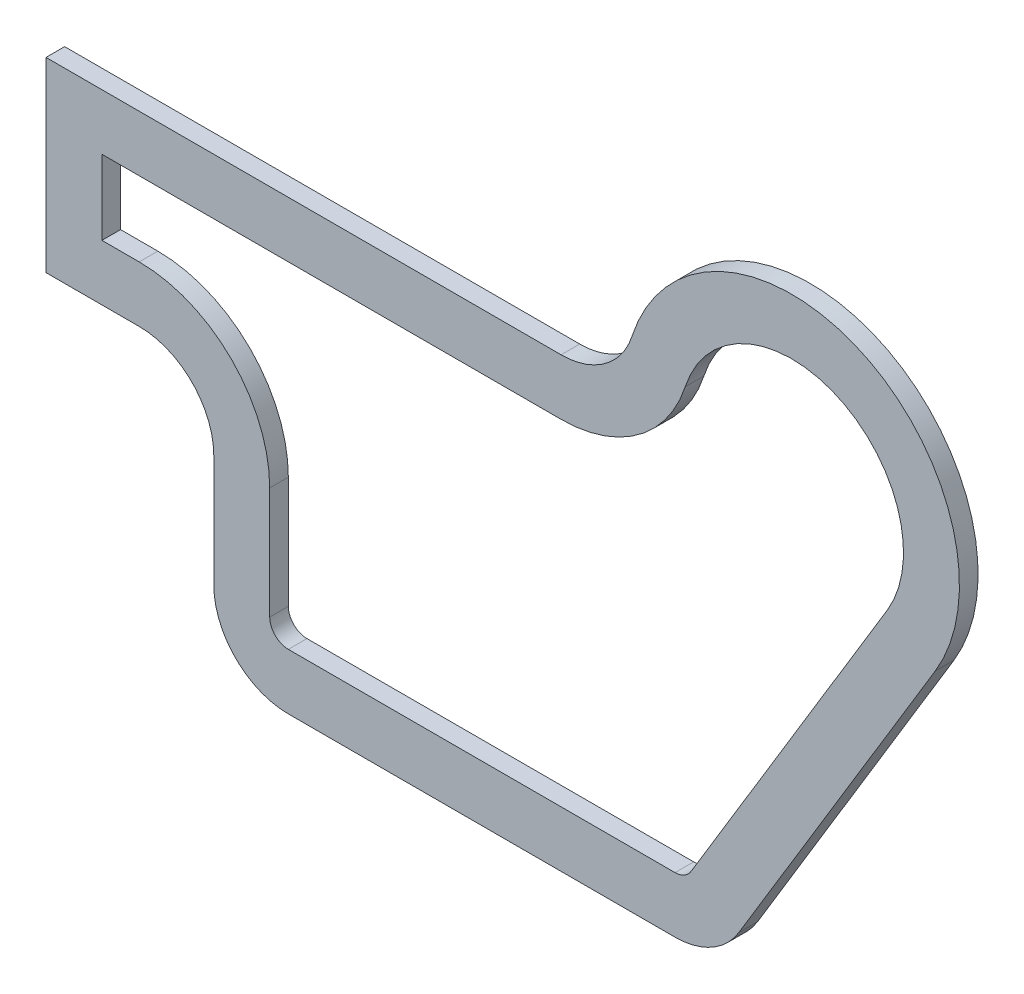
ISO-10303-21;
HEADER;
FILE_DESCRIPTION(('STEP AP214'),'2;1');
FILE_NAME('part.step','',(''),(''),'','','');
FILE_SCHEMA(('AUTOMOTIVE_DESIGN { 1 0 10303 214 1 1 1 1 }'));
ENDSEC;
DATA;
#1=APPLICATION_CONTEXT('core data for automotive mechanical design processes');
#2=APPLICATION_PROTOCOL_DEFINITION('international standard','automotive_design',2000,#1);
#3=PRODUCT_CONTEXT('',#1,'mechanical');
#4=PRODUCT('Part','Part','',(#3));
#5=PRODUCT_RELATED_PRODUCT_CATEGORY('part','',(#4));
#6=PRODUCT_DEFINITION_FORMATION('','',#4);
#7=PRODUCT_DEFINITION_CONTEXT('part definition',#1,'design');
#8=PRODUCT_DEFINITION('design','',#6,#7);
#9=PRODUCT_DEFINITION_SHAPE('','',#8);
#10=(LENGTH_UNIT() NAMED_UNIT(*) SI_UNIT(.MILLI.,.METRE.));
#11=(NAMED_UNIT(*) PLANE_ANGLE_UNIT() SI_UNIT($,.RADIAN.));
#12=(NAMED_UNIT(*) SI_UNIT($,.STERADIAN.) SOLID_ANGLE_UNIT());
#13=UNCERTAINTY_MEASURE_WITH_UNIT(LENGTH_MEASURE(1.E-05),#10,'distance_accuracy_value','');
#14=(GEOMETRIC_REPRESENTATION_CONTEXT(3) GLOBAL_UNCERTAINTY_ASSIGNED_CONTEXT((#13)) GLOBAL_UNIT_ASSIGNED_CONTEXT((#10,
#11,#12)) REPRESENTATION_CONTEXT('',''));
#15=CARTESIAN_POINT('',(0.,0.,0.));
#16=DIRECTION('',(0.,0.,1.));
#17=DIRECTION('',(1.,0.,0.));
#18=AXIS2_PLACEMENT_3D('',#15,#16,#17);
#19=CARTESIAN_POINT('',(-45.,120.,5.));
#20=DIRECTION('',(0.,-1.,0.));
#21=DIRECTION('',(0.,0.,-1.));
#22=AXIS2_PLACEMENT_3D('',#19,#20,#21);
#23=PLANE('',#22);
#24=DIRECTION('',(-1.,0.,0.));
#25=VECTOR('',#24,1.);
#26=CARTESIAN_POINT('',(-45.,120.,0.));
#27=LINE('',#26,#25);
#28=CARTESIAN_POINT('',(93.1534156157351,120.,0.));
#29=VERTEX_POINT('',#28);
#30=CARTESIAN_POINT('',(-45.,120.,0.));
#31=VERTEX_POINT('',#30);
#32=EDGE_CURVE('E287',#29,#31,#27,.T.);
#33=ORIENTED_EDGE('',*,*,#32,.T.);
#34=DIRECTION('',(0.,0.,-1.));
#35=VECTOR('',#34,1.);
#36=CARTESIAN_POINT('',(-45.,120.,5.));
#37=LINE('',#36,#35);
#38=CARTESIAN_POINT('',(-45.,120.,5.));
#39=VERTEX_POINT('',#38);
#40=EDGE_CURVE('E11',#39,#31,#37,.T.);
#41=ORIENTED_EDGE('',*,*,#40,.F.);
#42=DIRECTION('',(-1.,0.,0.));
#43=VECTOR('',#42,1.);
#44=CARTESIAN_POINT('',(-45.,120.,5.));
#45=LINE('',#44,#43);
#46=CARTESIAN_POINT('',(93.1534156157351,120.,5.));
#47=VERTEX_POINT('',#46);
#48=EDGE_CURVE('E314',#47,#39,#45,.T.);
#49=ORIENTED_EDGE('',*,*,#48,.F.);
#50=DIRECTION('',(0.,0.,-1.));
#51=VECTOR('',#50,1.);
#52=CARTESIAN_POINT('',(93.1534156157351,120.,5.));
#53=LINE('',#52,#51);
#54=EDGE_CURVE('E349',#47,#29,#53,.T.);
#55=ORIENTED_EDGE('',*,*,#54,.T.);
#56=EDGE_LOOP('',(#33,#41,#49,#55));
#57=FACE_BOUND('',#56,.T.);
#58=ADVANCED_FACE('F39',(#57),#23,.F.);
#59=CARTESIAN_POINT('',(-45.,120.,5.));
#60=DIRECTION('',(1.,0.,0.));
#61=DIRECTION('',(0.,0.,-1.));
#62=AXIS2_PLACEMENT_3D('',#59,#60,#61);
#63=PLANE('',#62);
#64=DIRECTION('',(0.,-1.,0.));
#65=VECTOR('',#64,1.);
#66=CARTESIAN_POINT('',(-45.,120.,0.));
#67=LINE('',#66,#65);
#68=CARTESIAN_POINT('',(-45.,70.,0.));
#69=VERTEX_POINT('',#68);
#70=EDGE_CURVE('E353',#31,#69,#67,.T.);
#71=ORIENTED_EDGE('',*,*,#70,.T.);
#72=DIRECTION('',(0.,0.,-1.));
#73=VECTOR('',#72,1.);
#74=CARTESIAN_POINT('',(-45.,70.,5.));
#75=LINE('',#74,#73);
#76=CARTESIAN_POINT('',(-45.,70.,5.));
#77=VERTEX_POINT('',#76);
#78=EDGE_CURVE('E47',#77,#69,#75,.T.);
#79=ORIENTED_EDGE('',*,*,#78,.F.);
#80=DIRECTION('',(0.,-1.,0.));
#81=VECTOR('',#80,1.);
#82=CARTESIAN_POINT('',(-45.,120.,5.));
#83=LINE('',#82,#81);
#84=EDGE_CURVE('E318',#39,#77,#83,.T.);
#85=ORIENTED_EDGE('',*,*,#84,.F.);
#86=ORIENTED_EDGE('',*,*,#40,.T.);
#87=EDGE_LOOP('',(#71,#79,#85,#86));
#88=FACE_BOUND('',#87,.T.);
#89=ADVANCED_FACE('F443',(#88),#63,.F.);
#90=CARTESIAN_POINT('',(-45.,70.,5.));
#91=DIRECTION('',(0.,1.,0.));
#92=DIRECTION('',(0.,0.,1.));
#93=AXIS2_PLACEMENT_3D('',#90,#91,#92);
#94=PLANE('',#93);
#95=DIRECTION('',(1.,0.,0.));
#96=VECTOR('',#95,1.);
#97=CARTESIAN_POINT('',(-45.,70.,0.));
#98=LINE('',#97,#96);
#99=CARTESIAN_POINT('',(-20.0000000000001,70.,0.));
#100=VERTEX_POINT('',#99);
#101=EDGE_CURVE('E356',#69,#100,#98,.T.);
#102=ORIENTED_EDGE('',*,*,#101,.T.);
#103=DIRECTION('',(0.,0.,-1.));
#104=VECTOR('',#103,1.);
#105=CARTESIAN_POINT('',(-20.0000000000001,70.,5.));
#106=LINE('',#105,#104);
#107=CARTESIAN_POINT('',(-20.0000000000001,70.,5.));
#108=VERTEX_POINT('',#107);
#109=EDGE_CURVE('E413',#108,#100,#106,.T.);
#110=ORIENTED_EDGE('',*,*,#109,.F.);
#111=DIRECTION('',(1.,0.,0.));
#112=VECTOR('',#111,1.);
#113=CARTESIAN_POINT('',(-45.,70.,5.));
#114=LINE('',#113,#112);
#115=EDGE_CURVE('E322',#77,#108,#114,.T.);
#116=ORIENTED_EDGE('',*,*,#115,.F.);
#117=ORIENTED_EDGE('',*,*,#78,.T.);
#118=EDGE_LOOP('',(#102,#110,#116,#117));
#119=FACE_BOUND('',#118,.T.);
#120=ADVANCED_FACE('F422',(#119),#94,.F.);
#121=CARTESIAN_POINT('',(-20.,50.,5.));
#122=DIRECTION('',(0.,0.,-1.));
#123=DIRECTION('',(-1.,0.,0.));
#124=AXIS2_PLACEMENT_3D('',#121,#122,#123);
#125=CYLINDRICAL_SURFACE('',#124,20.);
#126=CARTESIAN_POINT('',(-20.,50.,0.));
#127=DIRECTION('',(0.,0.,-1.));
#128=DIRECTION('',(-1.,0.,0.));
#129=AXIS2_PLACEMENT_3D('',#126,#127,#128);
#130=CIRCLE('',#129,20.);
#131=CARTESIAN_POINT('',(0.,49.9999999999999,0.));
#132=VERTEX_POINT('',#131);
#133=EDGE_CURVE('E359',#100,#132,#130,.T.);
#134=ORIENTED_EDGE('',*,*,#133,.T.);
#135=DIRECTION('',(0.,0.,-1.));
#136=VECTOR('',#135,1.);
#137=CARTESIAN_POINT('',(0.,49.9999999999999,5.));
#138=LINE('',#137,#136);
#139=CARTESIAN_POINT('',(0.,49.9999999999999,5.));
#140=VERTEX_POINT('',#139);
#141=EDGE_CURVE('E409',#140,#132,#138,.T.);
#142=ORIENTED_EDGE('',*,*,#141,.F.);
#143=CARTESIAN_POINT('',(-20.,50.,5.));
#144=DIRECTION('',(0.,0.,-1.));
#145=DIRECTION('',(-1.,0.,0.));
#146=AXIS2_PLACEMENT_3D('',#143,#144,#145);
#147=CIRCLE('',#146,20.);
#148=EDGE_CURVE('E325',#108,#140,#147,.T.);
#149=ORIENTED_EDGE('',*,*,#148,.F.);
#150=ORIENTED_EDGE('',*,*,#109,.T.);
#151=EDGE_LOOP('',(#134,#142,#149,#150));
#152=FACE_BOUND('',#151,.T.);
#153=ADVANCED_FACE('F431',(#152),#125,.F.);
#154=CARTESIAN_POINT('',(0.,49.9999999999999,5.));
#155=DIRECTION('',(1.,0.,0.));
#156=DIRECTION('',(0.,0.,-1.));
#157=AXIS2_PLACEMENT_3D('',#154,#155,#156);
#158=PLANE('',#157);
#159=DIRECTION('',(0.,-1.,0.));
#160=VECTOR('',#159,1.);
#161=CARTESIAN_POINT('',(0.,49.9999999999999,0.));
#162=LINE('',#161,#160);
#163=CARTESIAN_POINT('',(0.,20.0000000000001,0.));
#164=VERTEX_POINT('',#163);
#165=EDGE_CURVE('E362',#132,#164,#162,.T.);
#166=ORIENTED_EDGE('',*,*,#165,.T.);
#167=DIRECTION('',(0.,0.,-1.));
#168=VECTOR('',#167,1.);
#169=CARTESIAN_POINT('',(0.,20.0000000000001,5.));
#170=LINE('',#169,#168);
#171=CARTESIAN_POINT('',(0.,20.0000000000001,5.));
#172=VERTEX_POINT('',#171);
#173=EDGE_CURVE('E405',#172,#164,#170,.T.);
#174=ORIENTED_EDGE('',*,*,#173,.F.);
#175=DIRECTION('',(0.,-1.,0.));
#176=VECTOR('',#175,1.);
#177=CARTESIAN_POINT('',(0.,49.9999999999999,5.));
#178=LINE('',#177,#176);
#179=EDGE_CURVE('E328',#140,#172,#178,.T.);
#180=ORIENTED_EDGE('',*,*,#179,.F.);
#181=ORIENTED_EDGE('',*,*,#141,.T.);
#182=EDGE_LOOP('',(#166,#174,#180,#181));
#183=FACE_BOUND('',#182,.T.);
#184=ADVANCED_FACE('F435',(#183),#158,.F.);
#185=CARTESIAN_POINT('',(20.,20.,5.));
#186=DIRECTION('',(0.,0.,-1.));
#187=DIRECTION('',(-1.,0.,0.));
#188=AXIS2_PLACEMENT_3D('',#185,#186,#187);
#189=CYLINDRICAL_SURFACE('',#188,20.);
#190=CARTESIAN_POINT('',(20.,20.,0.));
#191=DIRECTION('',(0.,0.,1.));
#192=DIRECTION('',(1.,0.,0.));
#193=AXIS2_PLACEMENT_3D('',#190,#191,#192);
#194=CIRCLE('',#193,20.);
#195=CARTESIAN_POINT('',(20.0000000000001,0.,0.));
#196=VERTEX_POINT('',#195);
#197=EDGE_CURVE('E365',#164,#196,#194,.T.);
#198=ORIENTED_EDGE('',*,*,#197,.T.);
#199=DIRECTION('',(0.,0.,-1.));
#200=VECTOR('',#199,1.);
#201=CARTESIAN_POINT('',(20.0000000000001,0.,5.));
#202=LINE('',#201,#200);
#203=CARTESIAN_POINT('',(20.0000000000001,0.,5.));
#204=VERTEX_POINT('',#203);
#205=EDGE_CURVE('E401',#204,#196,#202,.T.);
#206=ORIENTED_EDGE('',*,*,#205,.F.);
#207=CARTESIAN_POINT('',(20.,20.,5.));
#208=DIRECTION('',(0.,0.,1.));
#209=DIRECTION('',(1.,0.,0.));
#210=AXIS2_PLACEMENT_3D('',#207,#208,#209);
#211=CIRCLE('',#210,20.);
#212=EDGE_CURVE('E331',#172,#204,#211,.T.);
#213=ORIENTED_EDGE('',*,*,#212,.F.);
#214=ORIENTED_EDGE('',*,*,#173,.T.);
#215=EDGE_LOOP('',(#198,#206,#213,#214));
#216=FACE_BOUND('',#215,.T.);
#217=ADVANCED_FACE('F471',(#216),#189,.T.);
#218=CARTESIAN_POINT('',(20.0000000000001,0.,5.));
#219=DIRECTION('',(0.,1.,0.));
#220=DIRECTION('',(0.,0.,1.));
#221=AXIS2_PLACEMENT_3D('',#218,#219,#220);
#222=PLANE('',#221);
#223=DIRECTION('',(1.,0.,0.));
#224=VECTOR('',#223,1.);
#225=CARTESIAN_POINT('',(20.0000000000001,0.,0.));
#226=LINE('',#225,#224);
#227=CARTESIAN_POINT('',(123.724055084294,0.,0.));
#228=VERTEX_POINT('',#227);
#229=EDGE_CURVE('E368',#196,#228,#226,.T.);
#230=ORIENTED_EDGE('',*,*,#229,.T.);
#231=DIRECTION('',(0.,0.,-1.));
#232=VECTOR('',#231,1.);
#233=CARTESIAN_POINT('',(123.724055084294,0.,5.));
#234=LINE('',#233,#232);
#235=CARTESIAN_POINT('',(123.724055084294,0.,5.));
#236=VERTEX_POINT('',#235);
#237=EDGE_CURVE('E397',#236,#228,#234,.T.);
#238=ORIENTED_EDGE('',*,*,#237,.F.);
#239=DIRECTION('',(1.,0.,0.));
#240=VECTOR('',#239,1.);
#241=CARTESIAN_POINT('',(20.0000000000001,0.,5.));
#242=LINE('',#241,#240);
#243=EDGE_CURVE('E334',#204,#236,#242,.T.);
#244=ORIENTED_EDGE('',*,*,#243,.F.);
#245=ORIENTED_EDGE('',*,*,#205,.T.);
#246=EDGE_LOOP('',(#230,#238,#244,#245));
#247=FACE_BOUND('',#246,.T.);
#248=ADVANCED_FACE('F469',(#247),#222,.F.);
#249=CARTESIAN_POINT('',(123.724055084294,20.,5.));
#250=DIRECTION('',(0.,0.,-1.));
#251=DIRECTION('',(-1.,0.,0.));
#252=AXIS2_PLACEMENT_3D('',#249,#250,#251);
#253=CYLINDRICAL_SURFACE('',#252,20.);
#254=CARTESIAN_POINT('',(123.724055084294,20.,0.));
#255=DIRECTION('',(0.,0.,1.));
#256=DIRECTION('',(1.,0.,0.));
#257=AXIS2_PLACEMENT_3D('',#254,#255,#256);
#258=CIRCLE('',#257,20.);
#259=CARTESIAN_POINT('',(140.836467876928,9.64793120122782,0.));
#260=VERTEX_POINT('',#259);
#261=EDGE_CURVE('E371',#228,#260,#258,.T.);
#262=ORIENTED_EDGE('',*,*,#261,.T.);
#263=DIRECTION('',(0.,0.,-1.));
#264=VECTOR('',#263,1.);
#265=CARTESIAN_POINT('',(140.836467876928,9.64793120122782,5.));
#266=LINE('',#265,#264);
#267=CARTESIAN_POINT('',(140.836467876928,9.64793120122782,5.));
#268=VERTEX_POINT('',#267);
#269=EDGE_CURVE('E393',#268,#260,#266,.T.);
#270=ORIENTED_EDGE('',*,*,#269,.F.);
#271=CARTESIAN_POINT('',(123.724055084294,20.,5.));
#272=DIRECTION('',(0.,0.,1.));
#273=DIRECTION('',(1.,0.,0.));
#274=AXIS2_PLACEMENT_3D('',#271,#272,#273);
#275=CIRCLE('',#274,20.);
#276=EDGE_CURVE('E337',#236,#268,#275,.T.);
#277=ORIENTED_EDGE('',*,*,#276,.F.);
#278=ORIENTED_EDGE('',*,*,#237,.T.);
#279=EDGE_LOOP('',(#262,#270,#277,#278));
#280=FACE_BOUND('',#279,.T.);
#281=ADVANCED_FACE('F464',(#280),#253,.T.);
#282=CARTESIAN_POINT('',(140.836467876928,9.64793120122783,5.));
#283=DIRECTION('',(-0.855620639631674,0.517603439938613,0.));
#284=DIRECTION('',(-0.517603439938613,-0.855620639631674,0.));
#285=AXIS2_PLACEMENT_3D('',#282,#283,#284);
#286=PLANE('',#285);
#287=DIRECTION('',(0.517603439938613,0.855620639631674,0.));
#288=VECTOR('',#287,1.);
#289=CARTESIAN_POINT('',(140.836467876928,9.64793120122783,0.));
#290=LINE('',#289,#288);
#291=CARTESIAN_POINT('',(193.502928783425,96.7078452027624,0.));
#292=VERTEX_POINT('',#291);
#293=EDGE_CURVE('E374',#260,#292,#290,.T.);
#294=ORIENTED_EDGE('',*,*,#293,.T.);
#295=DIRECTION('',(0.,0.,-1.));
#296=VECTOR('',#295,1.);
#297=CARTESIAN_POINT('',(193.502928783425,96.7078452027624,5.));
#298=LINE('',#297,#296);
#299=CARTESIAN_POINT('',(193.502928783425,96.7078452027624,5.));
#300=VERTEX_POINT('',#299);
#301=EDGE_CURVE('E389',#300,#292,#298,.T.);
#302=ORIENTED_EDGE('',*,*,#301,.F.);
#303=DIRECTION('',(0.517603439938613,0.855620639631674,0.));
#304=VECTOR('',#303,1.);
#305=CARTESIAN_POINT('',(140.836467876928,9.64793120122783,5.));
#306=LINE('',#305,#304);
#307=EDGE_CURVE('E340',#268,#300,#306,.T.);
#308=ORIENTED_EDGE('',*,*,#307,.F.);
#309=ORIENTED_EDGE('',*,*,#269,.T.);
#310=EDGE_LOOP('',(#294,#302,#308,#309));
#311=FACE_BOUND('',#310,.T.);
#312=ADVANCED_FACE('F459',(#311),#286,.F.);
#313=CARTESIAN_POINT('',(155.,120.,5.));
#314=DIRECTION('',(0.,0.,-1.));
#315=DIRECTION('',(-1.,0.,0.));
#316=AXIS2_PLACEMENT_3D('',#313,#314,#315);
#317=CYLINDRICAL_SURFACE('',#316,45.);
#318=CARTESIAN_POINT('',(155.,120.,0.));
#319=DIRECTION('',(0.,0.,1.));
#320=DIRECTION('',(1.,0.,0.));
#321=AXIS2_PLACEMENT_3D('',#318,#319,#320);
#322=CIRCLE('',#321,45.);
#323=CARTESIAN_POINT('',(112.183133887817,133.846153846154,0.));
#324=VERTEX_POINT('',#323);
#325=EDGE_CURVE('E377',#292,#324,#322,.T.);
#326=ORIENTED_EDGE('',*,*,#325,.T.);
#327=DIRECTION('',(0.,0.,-1.));
#328=VECTOR('',#327,1.);
#329=CARTESIAN_POINT('',(112.183133887817,133.846153846154,5.));
#330=LINE('',#329,#328);
#331=CARTESIAN_POINT('',(112.183133887817,133.846153846154,5.));
#332=VERTEX_POINT('',#331);
#333=EDGE_CURVE('E385',#332,#324,#330,.T.);
#334=ORIENTED_EDGE('',*,*,#333,.F.);
#335=CARTESIAN_POINT('',(155.,120.,5.));
#336=DIRECTION('',(0.,0.,1.));
#337=DIRECTION('',(1.,0.,0.));
#338=AXIS2_PLACEMENT_3D('',#335,#336,#337);
#339=CIRCLE('',#338,45.);
#340=EDGE_CURVE('E343',#300,#332,#339,.T.);
#341=ORIENTED_EDGE('',*,*,#340,.F.);
#342=ORIENTED_EDGE('',*,*,#301,.T.);
#343=EDGE_LOOP('',(#326,#334,#341,#342));
#344=FACE_BOUND('',#343,.T.);
#345=ADVANCED_FACE('F455',(#344),#317,.T.);
#346=CARTESIAN_POINT('',(93.1534156157351,140.,5.));
#347=DIRECTION('',(0.,0.,-1.));
#348=DIRECTION('',(-1.,0.,0.));
#349=AXIS2_PLACEMENT_3D('',#346,#347,#348);
#350=CYLINDRICAL_SURFACE('',#349,20.);
#351=CARTESIAN_POINT('',(93.1534156157351,140.,0.));
#352=DIRECTION('',(0.,0.,-1.));
#353=DIRECTION('',(1.,0.,0.));
#354=AXIS2_PLACEMENT_3D('',#351,#352,#353);
#355=CIRCLE('',#354,20.);
#356=EDGE_CURVE('E319',#324,#29,#355,.T.);
#357=ORIENTED_EDGE('',*,*,#356,.T.);
#358=ORIENTED_EDGE('',*,*,#54,.F.);
#359=CARTESIAN_POINT('',(93.1534156157351,140.,5.));
#360=DIRECTION('',(0.,0.,-1.));
#361=DIRECTION('',(1.,0.,0.));
#362=AXIS2_PLACEMENT_3D('',#359,#360,#361);
#363=CIRCLE('',#362,20.);
#364=EDGE_CURVE('E346',#332,#47,#363,.T.);
#365=ORIENTED_EDGE('',*,*,#364,.F.);
#366=ORIENTED_EDGE('',*,*,#333,.T.);
#367=EDGE_LOOP('',(#357,#358,#365,#366));
#368=FACE_BOUND('',#367,.T.);
#369=ADVANCED_FACE('F450',(#368),#350,.F.);
#370=CARTESIAN_POINT('',(93.1534156157351,140.,5.));
#371=DIRECTION('',(0.,0.,1.));
#372=DIRECTION('',(1.,0.,0.));
#373=AXIS2_PLACEMENT_3D('',#370,#371,#372);
#374=PLANE('',#373);
#375=CARTESIAN_POINT('',(93.1534156157351,140.,5.));
#376=DIRECTION('',(0.,0.,-1.));
#377=DIRECTION('',(1.,0.,0.));
#378=AXIS2_PLACEMENT_3D('',#375,#376,#377);
#379=CIRCLE('',#378,35.);
#380=CARTESIAN_POINT('',(126.455422591878,129.230769230769,5.));
#381=VERTEX_POINT('',#380);
#382=CARTESIAN_POINT('',(93.1534156157351,105.,5.));
#383=VERTEX_POINT('',#382);
#384=EDGE_CURVE('E54',#381,#383,#379,.T.);
#385=ORIENTED_EDGE('',*,*,#384,.F.);
#386=CARTESIAN_POINT('',(155.,120.,5.));
#387=DIRECTION('',(0.,0.,1.));
#388=DIRECTION('',(1.,0.,0.));
#389=AXIS2_PLACEMENT_3D('',#386,#387,#388);
#390=CIRCLE('',#389,30.);
#391=CARTESIAN_POINT('',(180.66861918895,104.471896801842,5.));
#392=VERTEX_POINT('',#391);
#393=EDGE_CURVE('E210',#392,#381,#390,.T.);
#394=ORIENTED_EDGE('',*,*,#393,.F.);
#395=DIRECTION('',(0.517603439938613,0.855620639631674,0.));
#396=VECTOR('',#395,1.);
#397=CARTESIAN_POINT('',(128.002158282453,17.411982800307,5.));
#398=LINE('',#397,#396);
#399=CARTESIAN_POINT('',(128.002158282453,17.411982800307,5.));
#400=VERTEX_POINT('',#399);
#401=EDGE_CURVE('E214',#400,#392,#398,.T.);
#402=ORIENTED_EDGE('',*,*,#401,.F.);
#403=CARTESIAN_POINT('',(123.724055084294,20.,5.));
#404=DIRECTION('',(0.,0.,1.));
#405=DIRECTION('',(1.,0.,0.));
#406=AXIS2_PLACEMENT_3D('',#403,#404,#405);
#407=CIRCLE('',#406,4.99999999999999);
#408=CARTESIAN_POINT('',(123.724055084294,15.,5.));
#409=VERTEX_POINT('',#408);
#410=EDGE_CURVE('E277',#409,#400,#407,.T.);
#411=ORIENTED_EDGE('',*,*,#410,.F.);
#412=DIRECTION('',(1.,0.,0.));
#413=VECTOR('',#412,1.);
#414=CARTESIAN_POINT('',(20.,15.,5.));
#415=LINE('',#414,#413);
#416=CARTESIAN_POINT('',(20.,15.,5.));
#417=VERTEX_POINT('',#416);
#418=EDGE_CURVE('E273',#417,#409,#415,.T.);
#419=ORIENTED_EDGE('',*,*,#418,.F.);
#420=CARTESIAN_POINT('',(20.,20.,5.));
#421=DIRECTION('',(0.,0.,1.));
#422=DIRECTION('',(1.,0.,0.));
#423=AXIS2_PLACEMENT_3D('',#420,#421,#422);
#424=CIRCLE('',#423,5.);
#425=CARTESIAN_POINT('',(15.,20.0000000000001,5.));
#426=VERTEX_POINT('',#425);
#427=EDGE_CURVE('E269',#426,#417,#424,.T.);
#428=ORIENTED_EDGE('',*,*,#427,.F.);
#429=DIRECTION('',(0.,-1.,0.));
#430=VECTOR('',#429,1.);
#431=CARTESIAN_POINT('',(15.,49.9999999999998,5.));
#432=LINE('',#431,#430);
#433=CARTESIAN_POINT('',(15.,49.9999999999997,5.));
#434=VERTEX_POINT('',#433);
#435=EDGE_CURVE('E265',#434,#426,#432,.T.);
#436=ORIENTED_EDGE('',*,*,#435,.F.);
#437=CARTESIAN_POINT('',(-20.,50.,5.));
#438=DIRECTION('',(0.,0.,-1.));
#439=DIRECTION('',(1.,0.,0.));
#440=AXIS2_PLACEMENT_3D('',#437,#438,#439);
#441=CIRCLE('',#440,35.);
#442=CARTESIAN_POINT('',(-20.0000000000001,85.,5.));
#443=VERTEX_POINT('',#442);
#444=EDGE_CURVE('E261',#443,#434,#441,.T.);
#445=ORIENTED_EDGE('',*,*,#444,.F.);
#446=DIRECTION('',(1.,0.,0.));
#447=VECTOR('',#446,1.);
#448=CARTESIAN_POINT('',(-30.,85.,5.));
#449=LINE('',#448,#447);
#450=CARTESIAN_POINT('',(-30.,85.,5.));
#451=VERTEX_POINT('',#450);
#452=EDGE_CURVE('E257',#451,#443,#449,.T.);
#453=ORIENTED_EDGE('',*,*,#452,.F.);
#454=DIRECTION('',(0.,-1.,0.));
#455=VECTOR('',#454,1.);
#456=CARTESIAN_POINT('',(-30.,105.,5.));
#457=LINE('',#456,#455);
#458=CARTESIAN_POINT('',(-30.,105.,5.));
#459=VERTEX_POINT('',#458);
#460=EDGE_CURVE('E253',#459,#451,#457,.T.);
#461=ORIENTED_EDGE('',*,*,#460,.F.);
#462=DIRECTION('',(-1.,0.,0.));
#463=VECTOR('',#462,1.);
#464=CARTESIAN_POINT('',(93.1534156157351,105.,5.));
#465=LINE('',#464,#463);
#466=EDGE_CURVE('E250',#383,#459,#465,.T.);
#467=ORIENTED_EDGE('',*,*,#466,.F.);
#468=EDGE_LOOP('',(#385,#394,#402,#411,#419,#428,#436,#445,#453,#461,#467));
#469=FACE_BOUND('',#468,.T.);
#470=ORIENTED_EDGE('',*,*,#48,.T.);
#471=ORIENTED_EDGE('',*,*,#84,.T.);
#472=ORIENTED_EDGE('',*,*,#115,.T.);
#473=ORIENTED_EDGE('',*,*,#148,.T.);
#474=ORIENTED_EDGE('',*,*,#179,.T.);
#475=ORIENTED_EDGE('',*,*,#212,.T.);
#476=ORIENTED_EDGE('',*,*,#243,.T.);
#477=ORIENTED_EDGE('',*,*,#276,.T.);
#478=ORIENTED_EDGE('',*,*,#307,.T.);
#479=ORIENTED_EDGE('',*,*,#340,.T.);
#480=ORIENTED_EDGE('',*,*,#364,.T.);
#481=EDGE_LOOP('',(#470,#471,#472,#473,#474,#475,#476,#477,#478,#479,#480));
#482=FACE_BOUND('',#481,.T.);
#483=ADVANCED_FACE('F439',(#469,#482),#374,.T.);
#484=CARTESIAN_POINT('',(93.1534156157351,140.,0.));
#485=DIRECTION('',(0.,0.,1.));
#486=DIRECTION('',(1.,0.,0.));
#487=AXIS2_PLACEMENT_3D('',#484,#485,#486);
#488=PLANE('',#487);
#489=CARTESIAN_POINT('',(155.,120.,0.));
#490=DIRECTION('',(0.,0.,1.));
#491=DIRECTION('',(1.,0.,0.));
#492=AXIS2_PLACEMENT_3D('',#489,#490,#491);
#493=CIRCLE('',#492,30.);
#494=CARTESIAN_POINT('',(180.66861918895,104.471896801842,0.));
#495=VERTEX_POINT('',#494);
#496=CARTESIAN_POINT('',(126.455422591878,129.230769230769,0.));
#497=VERTEX_POINT('',#496);
#498=EDGE_CURVE('E197',#495,#497,#493,.T.);
#499=ORIENTED_EDGE('',*,*,#498,.T.);
#500=CARTESIAN_POINT('',(93.1534156157351,140.,0.));
#501=DIRECTION('',(0.,0.,-1.));
#502=DIRECTION('',(1.,0.,0.));
#503=AXIS2_PLACEMENT_3D('',#500,#501,#502);
#504=CIRCLE('',#503,35.);
#505=CARTESIAN_POINT('',(93.1534156157351,105.,0.));
#506=VERTEX_POINT('',#505);
#507=EDGE_CURVE('E190',#497,#506,#504,.T.);
#508=ORIENTED_EDGE('',*,*,#507,.T.);
#509=DIRECTION('',(-1.,0.,0.));
#510=VECTOR('',#509,1.);
#511=CARTESIAN_POINT('',(93.1534156157351,105.,0.));
#512=LINE('',#511,#510);
#513=CARTESIAN_POINT('',(-30.,105.,0.));
#514=VERTEX_POINT('',#513);
#515=EDGE_CURVE('E200',#506,#514,#512,.T.);
#516=ORIENTED_EDGE('',*,*,#515,.T.);
#517=DIRECTION('',(0.,-1.,0.));
#518=VECTOR('',#517,1.);
#519=CARTESIAN_POINT('',(-30.,105.,0.));
#520=LINE('',#519,#518);
#521=CARTESIAN_POINT('',(-30.,85.,0.));
#522=VERTEX_POINT('',#521);
#523=EDGE_CURVE('E62',#514,#522,#520,.T.);
#524=ORIENTED_EDGE('',*,*,#523,.T.);
#525=DIRECTION('',(1.,0.,0.));
#526=VECTOR('',#525,1.);
#527=CARTESIAN_POINT('',(-30.,85.,0.));
#528=LINE('',#527,#526);
#529=CARTESIAN_POINT('',(-20.0000000000001,85.,0.));
#530=VERTEX_POINT('',#529);
#531=EDGE_CURVE('E219',#522,#530,#528,.T.);
#532=ORIENTED_EDGE('',*,*,#531,.T.);
#533=CARTESIAN_POINT('',(-20.,50.,0.));
#534=DIRECTION('',(0.,0.,-1.));
#535=DIRECTION('',(1.,0.,0.));
#536=AXIS2_PLACEMENT_3D('',#533,#534,#535);
#537=CIRCLE('',#536,35.);
#538=CARTESIAN_POINT('',(15.,49.9999999999997,0.));
#539=VERTEX_POINT('',#538);
#540=EDGE_CURVE('E223',#530,#539,#537,.T.);
#541=ORIENTED_EDGE('',*,*,#540,.T.);
#542=DIRECTION('',(0.,-1.,0.));
#543=VECTOR('',#542,1.);
#544=CARTESIAN_POINT('',(15.,49.9999999999998,0.));
#545=LINE('',#544,#543);
#546=CARTESIAN_POINT('',(15.,20.0000000000001,0.));
#547=VERTEX_POINT('',#546);
#548=EDGE_CURVE('E227',#539,#547,#545,.T.);
#549=ORIENTED_EDGE('',*,*,#548,.T.);
#550=CARTESIAN_POINT('',(20.,20.,0.));
#551=DIRECTION('',(0.,0.,1.));
#552=DIRECTION('',(1.,0.,0.));
#553=AXIS2_PLACEMENT_3D('',#550,#551,#552);
#554=CIRCLE('',#553,5.);
#555=CARTESIAN_POINT('',(20.,15.,0.));
#556=VERTEX_POINT('',#555);
#557=EDGE_CURVE('E231',#547,#556,#554,.T.);
#558=ORIENTED_EDGE('',*,*,#557,.T.);
#559=DIRECTION('',(1.,0.,0.));
#560=VECTOR('',#559,1.);
#561=CARTESIAN_POINT('',(20.,15.,0.));
#562=LINE('',#561,#560);
#563=CARTESIAN_POINT('',(123.724055084294,15.,0.));
#564=VERTEX_POINT('',#563);
#565=EDGE_CURVE('E235',#556,#564,#562,.T.);
#566=ORIENTED_EDGE('',*,*,#565,.T.);
#567=CARTESIAN_POINT('',(123.724055084294,20.,0.));
#568=DIRECTION('',(0.,0.,1.));
#569=DIRECTION('',(1.,0.,0.));
#570=AXIS2_PLACEMENT_3D('',#567,#568,#569);
#571=CIRCLE('',#570,4.99999999999999);
#572=CARTESIAN_POINT('',(128.002158282453,17.411982800307,0.));
#573=VERTEX_POINT('',#572);
#574=EDGE_CURVE('E239',#564,#573,#571,.T.);
#575=ORIENTED_EDGE('',*,*,#574,.T.);
#576=DIRECTION('',(0.517603439938613,0.855620639631674,0.));
#577=VECTOR('',#576,1.);
#578=CARTESIAN_POINT('',(128.002158282453,17.411982800307,0.));
#579=LINE('',#578,#577);
#580=EDGE_CURVE('E243',#573,#495,#579,.T.);
#581=ORIENTED_EDGE('',*,*,#580,.T.);
#582=EDGE_LOOP('',(#499,#508,#516,#524,#532,#541,#549,#558,#566,#575,#581));
#583=FACE_BOUND('',#582,.T.);
#584=ORIENTED_EDGE('',*,*,#32,.F.);
#585=ORIENTED_EDGE('',*,*,#356,.F.);
#586=ORIENTED_EDGE('',*,*,#325,.F.);
#587=ORIENTED_EDGE('',*,*,#293,.F.);
#588=ORIENTED_EDGE('',*,*,#261,.F.);
#589=ORIENTED_EDGE('',*,*,#229,.F.);
#590=ORIENTED_EDGE('',*,*,#197,.F.);
#591=ORIENTED_EDGE('',*,*,#165,.F.);
#592=ORIENTED_EDGE('',*,*,#133,.F.);
#593=ORIENTED_EDGE('',*,*,#101,.F.);
#594=ORIENTED_EDGE('',*,*,#70,.F.);
#595=EDGE_LOOP('',(#584,#585,#586,#587,#588,#589,#590,#591,#592,#593,#594));
#596=FACE_BOUND('',#595,.T.);
#597=ADVANCED_FACE('F205',(#583,#596),#488,.F.);
#598=CARTESIAN_POINT('',(93.1534156157351,140.,0.));
#599=DIRECTION('',(0.,0.,1.));
#600=DIRECTION('',(1.,0.,0.));
#601=AXIS2_PLACEMENT_3D('',#598,#599,#600);
#602=CYLINDRICAL_SURFACE('',#601,35.);
#603=ORIENTED_EDGE('',*,*,#384,.T.);
#604=DIRECTION('',(0.,0.,1.));
#605=VECTOR('',#604,1.);
#606=CARTESIAN_POINT('',(93.1534156157351,105.,0.));
#607=LINE('',#606,#605);
#608=EDGE_CURVE('E186',#506,#383,#607,.T.);
#609=ORIENTED_EDGE('',*,*,#608,.F.);
#610=ORIENTED_EDGE('',*,*,#507,.F.);
#611=DIRECTION('',(0.,0.,1.));
#612=VECTOR('',#611,1.);
#613=CARTESIAN_POINT('',(126.455422591878,129.230769230769,0.));
#614=LINE('',#613,#612);
#615=EDGE_CURVE('E284',#497,#381,#614,.T.);
#616=ORIENTED_EDGE('',*,*,#615,.T.);
#617=EDGE_LOOP('',(#603,#609,#610,#616));
#618=FACE_BOUND('',#617,.T.);
#619=ADVANCED_FACE('F188',(#618),#602,.T.);
#620=CARTESIAN_POINT('',(155.,120.,0.));
#621=DIRECTION('',(0.,0.,1.));
#622=DIRECTION('',(1.,0.,0.));
#623=AXIS2_PLACEMENT_3D('',#620,#621,#622);
#624=CYLINDRICAL_SURFACE('',#623,30.);
#625=ORIENTED_EDGE('',*,*,#393,.T.);
#626=ORIENTED_EDGE('',*,*,#615,.F.);
#627=ORIENTED_EDGE('',*,*,#498,.F.);
#628=DIRECTION('',(0.,0.,1.));
#629=VECTOR('',#628,1.);
#630=CARTESIAN_POINT('',(180.66861918895,104.471896801842,0.));
#631=LINE('',#630,#629);
#632=EDGE_CURVE('E288',#495,#392,#631,.T.);
#633=ORIENTED_EDGE('',*,*,#632,.T.);
#634=EDGE_LOOP('',(#625,#626,#627,#633));
#635=FACE_BOUND('',#634,.T.);
#636=ADVANCED_FACE('F566',(#635),#624,.F.);
#637=CARTESIAN_POINT('',(128.002158282453,17.411982800307,0.));
#638=DIRECTION('',(0.855620639631674,-0.517603439938613,0.));
#639=DIRECTION('',(0.517603439938613,0.855620639631674,0.));
#640=AXIS2_PLACEMENT_3D('',#637,#638,#639);
#641=PLANE('',#640);
#642=ORIENTED_EDGE('',*,*,#401,.T.);
#643=ORIENTED_EDGE('',*,*,#632,.F.);
#644=ORIENTED_EDGE('',*,*,#580,.F.);
#645=DIRECTION('',(0.,0.,1.));
#646=VECTOR('',#645,1.);
#647=CARTESIAN_POINT('',(128.002158282453,17.411982800307,0.));
#648=LINE('',#647,#646);
#649=EDGE_CURVE('E291',#573,#400,#648,.T.);
#650=ORIENTED_EDGE('',*,*,#649,.T.);
#651=EDGE_LOOP('',(#642,#643,#644,#650));
#652=FACE_BOUND('',#651,.T.);
#653=ADVANCED_FACE('F575',(#652),#641,.F.);
#654=CARTESIAN_POINT('',(123.724055084294,20.,0.));
#655=DIRECTION('',(0.,0.,1.));
#656=DIRECTION('',(1.,0.,0.));
#657=AXIS2_PLACEMENT_3D('',#654,#655,#656);
#658=CYLINDRICAL_SURFACE('',#657,4.99999999999999);
#659=ORIENTED_EDGE('',*,*,#410,.T.);
#660=ORIENTED_EDGE('',*,*,#649,.F.);
#661=ORIENTED_EDGE('',*,*,#574,.F.);
#662=DIRECTION('',(0.,0.,1.));
#663=VECTOR('',#662,1.);
#664=CARTESIAN_POINT('',(123.724055084294,15.,0.));
#665=LINE('',#664,#663);
#666=EDGE_CURVE('E294',#564,#409,#665,.T.);
#667=ORIENTED_EDGE('',*,*,#666,.T.);
#668=EDGE_LOOP('',(#659,#660,#661,#667));
#669=FACE_BOUND('',#668,.T.);
#670=ADVANCED_FACE('F585',(#669),#658,.F.);
#671=CARTESIAN_POINT('',(20.,15.,0.));
#672=DIRECTION('',(0.,-1.,0.));
#673=DIRECTION('',(0.,0.,-1.));
#674=AXIS2_PLACEMENT_3D('',#671,#672,#673);
#675=PLANE('',#674);
#676=ORIENTED_EDGE('',*,*,#418,.T.);
#677=ORIENTED_EDGE('',*,*,#666,.F.);
#678=ORIENTED_EDGE('',*,*,#565,.F.);
#679=DIRECTION('',(0.,0.,1.));
#680=VECTOR('',#679,1.);
#681=CARTESIAN_POINT('',(20.,15.,0.));
#682=LINE('',#681,#680);
#683=EDGE_CURVE('E297',#556,#417,#682,.T.);
#684=ORIENTED_EDGE('',*,*,#683,.T.);
#685=EDGE_LOOP('',(#676,#677,#678,#684));
#686=FACE_BOUND('',#685,.T.);
#687=ADVANCED_FACE('F595',(#686),#675,.F.);
#688=CARTESIAN_POINT('',(20.,20.,0.));
#689=DIRECTION('',(0.,0.,1.));
#690=DIRECTION('',(1.,0.,0.));
#691=AXIS2_PLACEMENT_3D('',#688,#689,#690);
#692=CYLINDRICAL_SURFACE('',#691,5.);
#693=ORIENTED_EDGE('',*,*,#427,.T.);
#694=ORIENTED_EDGE('',*,*,#683,.F.);
#695=ORIENTED_EDGE('',*,*,#557,.F.);
#696=DIRECTION('',(0.,0.,1.));
#697=VECTOR('',#696,1.);
#698=CARTESIAN_POINT('',(15.,20.0000000000001,0.));
#699=LINE('',#698,#697);
#700=EDGE_CURVE('E300',#547,#426,#699,.T.);
#701=ORIENTED_EDGE('',*,*,#700,.T.);
#702=EDGE_LOOP('',(#693,#694,#695,#701));
#703=FACE_BOUND('',#702,.T.);
#704=ADVANCED_FACE('F605',(#703),#692,.F.);
#705=CARTESIAN_POINT('',(15.,49.9999999999998,0.));
#706=DIRECTION('',(-1.,0.,0.));
#707=DIRECTION('',(0.,0.,1.));
#708=AXIS2_PLACEMENT_3D('',#705,#706,#707);
#709=PLANE('',#708);
#710=ORIENTED_EDGE('',*,*,#435,.T.);
#711=ORIENTED_EDGE('',*,*,#700,.F.);
#712=ORIENTED_EDGE('',*,*,#548,.F.);
#713=DIRECTION('',(0.,0.,1.));
#714=VECTOR('',#713,1.);
#715=CARTESIAN_POINT('',(15.,49.9999999999997,0.));
#716=LINE('',#715,#714);
#717=EDGE_CURVE('E303',#539,#434,#716,.T.);
#718=ORIENTED_EDGE('',*,*,#717,.T.);
#719=EDGE_LOOP('',(#710,#711,#712,#718));
#720=FACE_BOUND('',#719,.T.);
#721=ADVANCED_FACE('F615',(#720),#709,.F.);
#722=CARTESIAN_POINT('',(-20.,50.,0.));
#723=DIRECTION('',(0.,0.,1.));
#724=DIRECTION('',(1.,0.,0.));
#725=AXIS2_PLACEMENT_3D('',#722,#723,#724);
#726=CYLINDRICAL_SURFACE('',#725,35.);
#727=ORIENTED_EDGE('',*,*,#444,.T.);
#728=ORIENTED_EDGE('',*,*,#717,.F.);
#729=ORIENTED_EDGE('',*,*,#540,.F.);
#730=DIRECTION('',(0.,0.,1.));
#731=VECTOR('',#730,1.);
#732=CARTESIAN_POINT('',(-20.0000000000001,85.,0.));
#733=LINE('',#732,#731);
#734=EDGE_CURVE('E306',#530,#443,#733,.T.);
#735=ORIENTED_EDGE('',*,*,#734,.T.);
#736=EDGE_LOOP('',(#727,#728,#729,#735));
#737=FACE_BOUND('',#736,.T.);
#738=ADVANCED_FACE('F625',(#737),#726,.T.);
#739=CARTESIAN_POINT('',(-30.,85.,0.));
#740=DIRECTION('',(0.,-1.,0.));
#741=DIRECTION('',(0.,0.,-1.));
#742=AXIS2_PLACEMENT_3D('',#739,#740,#741);
#743=PLANE('',#742);
#744=ORIENTED_EDGE('',*,*,#452,.T.);
#745=ORIENTED_EDGE('',*,*,#734,.F.);
#746=ORIENTED_EDGE('',*,*,#531,.F.);
#747=DIRECTION('',(0.,0.,1.));
#748=VECTOR('',#747,1.);
#749=CARTESIAN_POINT('',(-30.,85.,0.));
#750=LINE('',#749,#748);
#751=EDGE_CURVE('E309',#522,#451,#750,.T.);
#752=ORIENTED_EDGE('',*,*,#751,.T.);
#753=EDGE_LOOP('',(#744,#745,#746,#752));
#754=FACE_BOUND('',#753,.T.);
#755=ADVANCED_FACE('F635',(#754),#743,.F.);
#756=CARTESIAN_POINT('',(-30.,105.,0.));
#757=DIRECTION('',(-1.,0.,0.));
#758=DIRECTION('',(0.,0.,1.));
#759=AXIS2_PLACEMENT_3D('',#756,#757,#758);
#760=PLANE('',#759);
#761=ORIENTED_EDGE('',*,*,#460,.T.);
#762=ORIENTED_EDGE('',*,*,#751,.F.);
#763=ORIENTED_EDGE('',*,*,#523,.F.);
#764=DIRECTION('',(0.,0.,1.));
#765=VECTOR('',#764,1.);
#766=CARTESIAN_POINT('',(-30.,105.,0.));
#767=LINE('',#766,#765);
#768=EDGE_CURVE('E196',#514,#459,#767,.T.);
#769=ORIENTED_EDGE('',*,*,#768,.T.);
#770=EDGE_LOOP('',(#761,#762,#763,#769));
#771=FACE_BOUND('',#770,.T.);
#772=ADVANCED_FACE('F645',(#771),#760,.F.);
#773=CARTESIAN_POINT('',(93.1534156157351,105.,0.));
#774=DIRECTION('',(0.,1.,0.));
#775=DIRECTION('',(0.,0.,1.));
#776=AXIS2_PLACEMENT_3D('',#773,#774,#775);
#777=PLANE('',#776);
#778=ORIENTED_EDGE('',*,*,#466,.T.);
#779=ORIENTED_EDGE('',*,*,#768,.F.);
#780=ORIENTED_EDGE('',*,*,#515,.F.);
#781=ORIENTED_EDGE('',*,*,#608,.T.);
#782=EDGE_LOOP('',(#778,#779,#780,#781));
#783=FACE_BOUND('',#782,.T.);
#784=ADVANCED_FACE('F201',(#783),#777,.F.);
#785=CLOSED_SHELL('',(#58,#89,#120,#153,#184,#217,#248,#281,#312,#345,#369,#483,#597,#619,#636,
#653,#670,#687,#704,#721,#738,#755,#772,#784));
#786=MANIFOLD_SOLID_BREP('B2',#785);
#787=ADVANCED_BREP_SHAPE_REPRESENTATION('',(#18,#786),#14);
#788=SHAPE_DEFINITION_REPRESENTATION(#9,#787);
ENDSEC;
END-ISO-10303-21;
